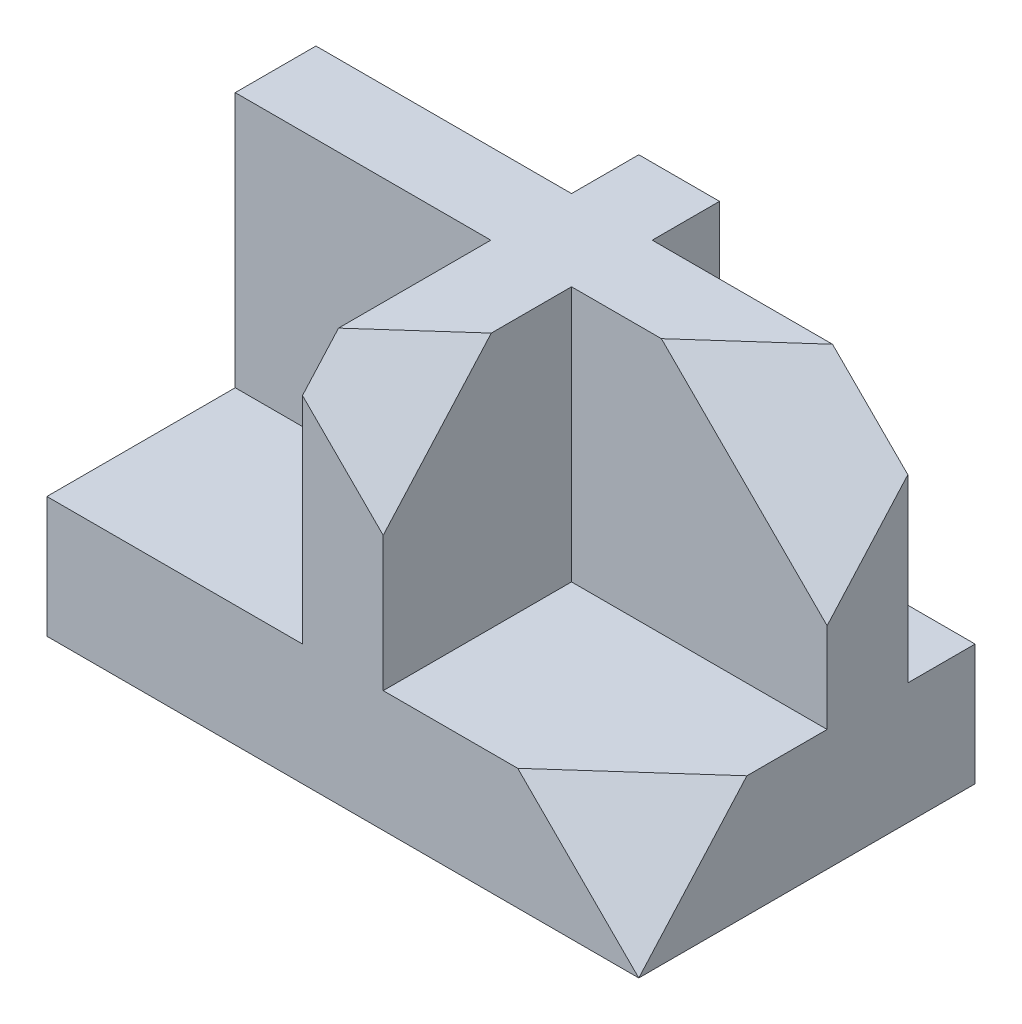
ISO-10303-21;
HEADER;
FILE_DESCRIPTION(('STEP AP214'),'2;1');
FILE_NAME('part.step','',(''),(''),'','','');
FILE_SCHEMA(('AUTOMOTIVE_DESIGN { 1 0 10303 214 1 1 1 1 }'));
ENDSEC;
DATA;
#1=APPLICATION_CONTEXT('core data for automotive mechanical design processes');
#2=APPLICATION_PROTOCOL_DEFINITION('international standard','automotive_design',2000,#1);
#3=PRODUCT_CONTEXT('',#1,'mechanical');
#4=PRODUCT('Part','Part','',(#3));
#5=PRODUCT_RELATED_PRODUCT_CATEGORY('part','',(#4));
#6=PRODUCT_DEFINITION_FORMATION('','',#4);
#7=PRODUCT_DEFINITION_CONTEXT('part definition',#1,'design');
#8=PRODUCT_DEFINITION('design','',#6,#7);
#9=PRODUCT_DEFINITION_SHAPE('','',#8);
#10=(LENGTH_UNIT() NAMED_UNIT(*) SI_UNIT(.MILLI.,.METRE.));
#11=(NAMED_UNIT(*) PLANE_ANGLE_UNIT() SI_UNIT($,.RADIAN.));
#12=(NAMED_UNIT(*) SI_UNIT($,.STERADIAN.) SOLID_ANGLE_UNIT());
#13=UNCERTAINTY_MEASURE_WITH_UNIT(LENGTH_MEASURE(1.E-05),#10,'distance_accuracy_value','');
#14=(GEOMETRIC_REPRESENTATION_CONTEXT(3) GLOBAL_UNCERTAINTY_ASSIGNED_CONTEXT((#13)) GLOBAL_UNIT_ASSIGNED_CONTEXT((#10,
#11,#12)) REPRESENTATION_CONTEXT('',''));
#15=CARTESIAN_POINT('',(0.,0.,0.));
#16=DIRECTION('',(0.,0.,1.));
#17=DIRECTION('',(1.,0.,0.));
#18=AXIS2_PLACEMENT_3D('',#15,#16,#17);
#19=CARTESIAN_POINT('',(0.,18.,0.));
#20=DIRECTION('',(0.,-1.,0.));
#21=DIRECTION('',(0.,0.,-1.));
#22=AXIS2_PLACEMENT_3D('',#19,#20,#21);
#23=PLANE('',#22);
#24=DIRECTION('',(-0.745937661625918,0.,0.666015769308848));
#25=VECTOR('',#24,1.);
#26=CARTESIAN_POINT('',(31.0503903477639,18.,34.776437189496));
#27=LINE('',#26,#25);
#28=CARTESIAN_POINT('',(88.,18.,-16.0714285714286));
#29=VERTEX_POINT('',#28);
#30=CARTESIAN_POINT('',(69.9999999999998,18.,0.));
#31=VERTEX_POINT('',#30);
#32=EDGE_CURVE('E200',#29,#31,#27,.T.);
#33=ORIENTED_EDGE('',*,*,#32,.F.);
#34=DIRECTION('',(0.,0.,-1.));
#35=VECTOR('',#34,1.);
#36=CARTESIAN_POINT('',(88.,18.,0.));
#37=LINE('',#36,#35);
#38=CARTESIAN_POINT('',(88.,18.,-28.));
#39=VERTEX_POINT('',#38);
#40=EDGE_CURVE('E259',#29,#39,#37,.T.);
#41=ORIENTED_EDGE('',*,*,#40,.T.);
#42=DIRECTION('',(1.,0.,0.));
#43=VECTOR('',#42,1.);
#44=CARTESIAN_POINT('',(50.,18.,-28.));
#45=LINE('',#44,#43);
#46=CARTESIAN_POINT('',(50.,18.,-28.));
#47=VERTEX_POINT('',#46);
#48=EDGE_CURVE('E212',#47,#39,#45,.T.);
#49=ORIENTED_EDGE('',*,*,#48,.F.);
#50=DIRECTION('',(0.,0.,-1.));
#51=VECTOR('',#50,1.);
#52=CARTESIAN_POINT('',(50.,18.,-28.));
#53=LINE('',#52,#51);
#54=CARTESIAN_POINT('',(50.,18.,0.));
#55=VERTEX_POINT('',#54);
#56=EDGE_CURVE('E209',#55,#47,#53,.T.);
#57=ORIENTED_EDGE('',*,*,#56,.F.);
#58=DIRECTION('',(1.,0.,0.));
#59=VECTOR('',#58,1.);
#60=CARTESIAN_POINT('',(0.,18.,0.));
#61=LINE('',#60,#59);
#62=EDGE_CURVE('E253',#55,#31,#61,.T.);
#63=ORIENTED_EDGE('',*,*,#62,.T.);
#64=EDGE_LOOP('',(#33,#41,#49,#57,#63));
#65=FACE_BOUND('',#64,.T.);
#66=ADVANCED_FACE('F36',(#65),#23,.F.);
#67=CARTESIAN_POINT('',(0.,18.,0.));
#68=DIRECTION('',(0.,0.,-1.));
#69=DIRECTION('',(-1.,0.,0.));
#70=AXIS2_PLACEMENT_3D('',#67,#68,#69);
#71=PLANE('',#70);
#72=DIRECTION('',(0.707106781186551,-0.707106781186544,0.));
#73=VECTOR('',#72,1.);
#74=CARTESIAN_POINT('',(34.9999999999995,52.9999999999999,0.));
#75=LINE('',#74,#73);
#76=CARTESIAN_POINT('',(38.,49.9999999999995,0.));
#77=VERTEX_POINT('',#76);
#78=CARTESIAN_POINT('',(50.,37.9999999999996,0.));
#79=VERTEX_POINT('',#78);
#80=EDGE_CURVE('E320',#77,#79,#75,.T.);
#81=ORIENTED_EDGE('',*,*,#80,.F.);
#82=DIRECTION('',(0.,-1.,0.));
#83=VECTOR('',#82,1.);
#84=CARTESIAN_POINT('',(38.,56.,0.));
#85=LINE('',#84,#83);
#86=CARTESIAN_POINT('',(38.,18.,0.));
#87=VERTEX_POINT('',#86);
#88=EDGE_CURVE('E236',#77,#87,#85,.T.);
#89=ORIENTED_EDGE('',*,*,#88,.T.);
#90=CARTESIAN_POINT('',(0.,18.,0.));
#91=VERTEX_POINT('',#90);
#92=EDGE_CURVE('E255',#91,#87,#61,.T.);
#93=ORIENTED_EDGE('',*,*,#92,.F.);
#94=DIRECTION('',(0.,-1.,0.));
#95=VECTOR('',#94,1.);
#96=CARTESIAN_POINT('',(0.,18.,0.));
#97=LINE('',#96,#95);
#98=CARTESIAN_POINT('',(0.,0.,0.));
#99=VERTEX_POINT('',#98);
#100=EDGE_CURVE('E167',#91,#99,#97,.T.);
#101=ORIENTED_EDGE('',*,*,#100,.T.);
#102=DIRECTION('',(1.,0.,0.));
#103=VECTOR('',#102,1.);
#104=CARTESIAN_POINT('',(0.,0.,0.));
#105=LINE('',#104,#103);
#106=CARTESIAN_POINT('',(88.,0.,0.));
#107=VERTEX_POINT('',#106);
#108=EDGE_CURVE('E267',#99,#107,#105,.T.);
#109=ORIENTED_EDGE('',*,*,#108,.T.);
#110=EDGE_CURVE('E319',#31,#107,#75,.T.);
#111=ORIENTED_EDGE('',*,*,#110,.F.);
#112=ORIENTED_EDGE('',*,*,#62,.F.);
#113=DIRECTION('',(0.,-1.,0.));
#114=VECTOR('',#113,1.);
#115=CARTESIAN_POINT('',(50.,56.,0.));
#116=LINE('',#115,#114);
#117=EDGE_CURVE('E234',#79,#55,#116,.T.);
#118=ORIENTED_EDGE('',*,*,#117,.F.);
#119=EDGE_LOOP('',(#81,#89,#93,#101,#109,#111,#112,#118));
#120=FACE_BOUND('',#119,.T.);
#121=ADVANCED_FACE('F283',(#120),#71,.F.);
#122=CARTESIAN_POINT('',(88.,18.,0.));
#123=DIRECTION('',(-1.,0.,0.));
#124=DIRECTION('',(0.,0.,1.));
#125=AXIS2_PLACEMENT_3D('',#122,#123,#124);
#126=PLANE('',#125);
#127=DIRECTION('',(0.,0.745937661625915,-0.666015769308852));
#128=VECTOR('',#127,1.);
#129=CARTESIAN_POINT('',(88.,10.0156139105749,-8.94251242015614));
#130=LINE('',#129,#128);
#131=EDGE_CURVE('E301',#107,#29,#130,.T.);
#132=ORIENTED_EDGE('',*,*,#131,.F.);
#133=DIRECTION('',(0.,0.,-1.));
#134=VECTOR('',#133,1.);
#135=CARTESIAN_POINT('',(88.,0.,0.));
#136=LINE('',#135,#134);
#137=CARTESIAN_POINT('',(88.,0.,-50.));
#138=VERTEX_POINT('',#137);
#139=EDGE_CURVE('E270',#107,#138,#136,.T.);
#140=ORIENTED_EDGE('',*,*,#139,.T.);
#141=DIRECTION('',(0.,-1.,0.));
#142=VECTOR('',#141,1.);
#143=CARTESIAN_POINT('',(88.,18.,-50.));
#144=LINE('',#143,#142);
#145=CARTESIAN_POINT('',(88.,18.,-50.));
#146=VERTEX_POINT('',#145);
#147=EDGE_CURVE('E276',#146,#138,#144,.T.);
#148=ORIENTED_EDGE('',*,*,#147,.F.);
#149=CARTESIAN_POINT('',(88.,18.,-40.));
#150=VERTEX_POINT('',#149);
#151=EDGE_CURVE('E258',#150,#146,#37,.T.);
#152=ORIENTED_EDGE('',*,*,#151,.F.);
#153=DIRECTION('',(0.,-1.,0.));
#154=VECTOR('',#153,1.);
#155=CARTESIAN_POINT('',(88.,56.,-40.));
#156=LINE('',#155,#154);
#157=CARTESIAN_POINT('',(88.,44.8,-40.));
#158=VERTEX_POINT('',#157);
#159=EDGE_CURVE('E229',#158,#150,#156,.T.);
#160=ORIENTED_EDGE('',*,*,#159,.F.);
#161=CARTESIAN_POINT('',(88.,31.36,-28.));
#162=VERTEX_POINT('',#161);
#163=EDGE_CURVE('E177',#162,#158,#130,.T.);
#164=ORIENTED_EDGE('',*,*,#163,.F.);
#165=DIRECTION('',(0.,-1.,0.));
#166=VECTOR('',#165,1.);
#167=CARTESIAN_POINT('',(88.,56.,-28.));
#168=LINE('',#167,#166);
#169=EDGE_CURVE('E176',#162,#39,#168,.T.);
#170=ORIENTED_EDGE('',*,*,#169,.T.);
#171=ORIENTED_EDGE('',*,*,#40,.F.);
#172=EDGE_LOOP('',(#132,#140,#148,#152,#160,#164,#170,#171));
#173=FACE_BOUND('',#172,.T.);
#174=ADVANCED_FACE('F297',(#173),#126,.F.);
#175=CARTESIAN_POINT('',(38.,56.,-28.));
#176=DIRECTION('',(1.,0.,0.));
#177=DIRECTION('',(0.,0.,-1.));
#178=AXIS2_PLACEMENT_3D('',#175,#176,#177);
#179=PLANE('',#178);
#180=DIRECTION('',(0.,-0.745937661625915,0.666015769308852));
#181=VECTOR('',#180,1.);
#182=CARTESIAN_POINT('',(38.,67.2491128459898,-15.4009936124914));
#183=LINE('',#182,#181);
#184=CARTESIAN_POINT('',(38.,56.,-5.35714285714331));
#185=VERTEX_POINT('',#184);
#186=EDGE_CURVE('E317',#185,#77,#183,.T.);
#187=ORIENTED_EDGE('',*,*,#186,.F.);
#188=DIRECTION('',(0.,0.,1.));
#189=VECTOR('',#188,1.);
#190=CARTESIAN_POINT('',(38.,56.,-28.));
#191=LINE('',#190,#189);
#192=CARTESIAN_POINT('',(38.,56.,-28.));
#193=VERTEX_POINT('',#192);
#194=EDGE_CURVE('E188',#193,#185,#191,.T.);
#195=ORIENTED_EDGE('',*,*,#194,.F.);
#196=DIRECTION('',(0.,-1.,0.));
#197=VECTOR('',#196,1.);
#198=CARTESIAN_POINT('',(38.,56.,-28.));
#199=LINE('',#198,#197);
#200=CARTESIAN_POINT('',(38.,18.,-28.));
#201=VERTEX_POINT('',#200);
#202=EDGE_CURVE('E238',#193,#201,#199,.T.);
#203=ORIENTED_EDGE('',*,*,#202,.T.);
#204=DIRECTION('',(0.,0.,1.));
#205=VECTOR('',#204,1.);
#206=CARTESIAN_POINT('',(38.,18.,-28.));
#207=LINE('',#206,#205);
#208=EDGE_CURVE('E206',#201,#87,#207,.T.);
#209=ORIENTED_EDGE('',*,*,#208,.T.);
#210=ORIENTED_EDGE('',*,*,#88,.F.);
#211=EDGE_LOOP('',(#187,#195,#203,#209,#210));
#212=FACE_BOUND('',#211,.T.);
#213=ADVANCED_FACE('F339',(#212),#179,.F.);
#214=CARTESIAN_POINT('',(50.,56.,-28.));
#215=DIRECTION('',(-1.,0.,0.));
#216=DIRECTION('',(0.,0.,1.));
#217=AXIS2_PLACEMENT_3D('',#214,#215,#216);
#218=PLANE('',#217);
#219=DIRECTION('',(0.,0.745937661625915,-0.666015769308852));
#220=VECTOR('',#219,1.);
#221=CARTESIAN_POINT('',(50.,61.9261887863731,-21.3626685592621));
#222=LINE('',#221,#220);
#223=CARTESIAN_POINT('',(50.,56.,-16.0714285714289));
#224=VERTEX_POINT('',#223);
#225=EDGE_CURVE('E59',#79,#224,#222,.T.);
#226=ORIENTED_EDGE('',*,*,#225,.F.);
#227=ORIENTED_EDGE('',*,*,#117,.T.);
#228=ORIENTED_EDGE('',*,*,#56,.T.);
#229=DIRECTION('',(0.,-1.,0.));
#230=VECTOR('',#229,1.);
#231=CARTESIAN_POINT('',(50.,56.,-28.));
#232=LINE('',#231,#230);
#233=CARTESIAN_POINT('',(50.,56.,-28.));
#234=VERTEX_POINT('',#233);
#235=EDGE_CURVE('E232',#234,#47,#232,.T.);
#236=ORIENTED_EDGE('',*,*,#235,.F.);
#237=DIRECTION('',(0.,0.,-1.));
#238=VECTOR('',#237,1.);
#239=CARTESIAN_POINT('',(50.,56.,-28.));
#240=LINE('',#239,#238);
#241=EDGE_CURVE('E182',#224,#234,#240,.T.);
#242=ORIENTED_EDGE('',*,*,#241,.F.);
#243=EDGE_LOOP('',(#226,#227,#228,#236,#242));
#244=FACE_BOUND('',#243,.T.);
#245=ADVANCED_FACE('F347',(#244),#218,.F.);
#246=CARTESIAN_POINT('',(50.,56.,-28.));
#247=DIRECTION('',(0.,0.,-1.));
#248=DIRECTION('',(-1.,0.,0.));
#249=AXIS2_PLACEMENT_3D('',#246,#247,#248);
#250=PLANE('',#249);
#251=DIRECTION('',(0.707106781186551,-0.707106781186544,0.));
#252=VECTOR('',#251,1.);
#253=CARTESIAN_POINT('',(56.6799999999998,62.6799999999999,-28.));
#254=LINE('',#253,#252);
#255=CARTESIAN_POINT('',(63.3599999999997,56.,-28.));
#256=VERTEX_POINT('',#255);
#257=EDGE_CURVE('E162',#256,#162,#254,.T.);
#258=ORIENTED_EDGE('',*,*,#257,.F.);
#259=DIRECTION('',(1.,0.,0.));
#260=VECTOR('',#259,1.);
#261=CARTESIAN_POINT('',(50.,56.,-28.));
#262=LINE('',#261,#260);
#263=EDGE_CURVE('E173',#234,#256,#262,.T.);
#264=ORIENTED_EDGE('',*,*,#263,.F.);
#265=ORIENTED_EDGE('',*,*,#235,.T.);
#266=ORIENTED_EDGE('',*,*,#48,.T.);
#267=ORIENTED_EDGE('',*,*,#169,.F.);
#268=EDGE_LOOP('',(#258,#264,#265,#266,#267));
#269=FACE_BOUND('',#268,.T.);
#270=ADVANCED_FACE('F171',(#269),#250,.F.);
#271=CARTESIAN_POINT('',(50.,56.,-40.));
#272=DIRECTION('',(0.,0.,1.));
#273=DIRECTION('',(1.,0.,0.));
#274=AXIS2_PLACEMENT_3D('',#271,#272,#273);
#275=PLANE('',#274);
#276=DIRECTION('',(-0.707106781186551,0.707106781186544,0.));
#277=VECTOR('',#276,1.);
#278=CARTESIAN_POINT('',(63.3999999999998,69.3999999999999,-40.));
#279=LINE('',#278,#277);
#280=CARTESIAN_POINT('',(76.7999999999999,56.,-40.));
#281=VERTEX_POINT('',#280);
#282=EDGE_CURVE('E51',#158,#281,#279,.T.);
#283=ORIENTED_EDGE('',*,*,#282,.F.);
#284=ORIENTED_EDGE('',*,*,#159,.T.);
#285=DIRECTION('',(-1.,0.,0.));
#286=VECTOR('',#285,1.);
#287=CARTESIAN_POINT('',(50.,18.,-40.));
#288=LINE('',#287,#286);
#289=CARTESIAN_POINT('',(50.,18.,-40.));
#290=VERTEX_POINT('',#289);
#291=EDGE_CURVE('E214',#150,#290,#288,.T.);
#292=ORIENTED_EDGE('',*,*,#291,.T.);
#293=DIRECTION('',(0.,-1.,0.));
#294=VECTOR('',#293,1.);
#295=CARTESIAN_POINT('',(50.,56.,-40.));
#296=LINE('',#295,#294);
#297=CARTESIAN_POINT('',(50.,56.,-40.));
#298=VERTEX_POINT('',#297);
#299=EDGE_CURVE('E226',#298,#290,#296,.T.);
#300=ORIENTED_EDGE('',*,*,#299,.F.);
#301=DIRECTION('',(-1.,0.,0.));
#302=VECTOR('',#301,1.);
#303=CARTESIAN_POINT('',(50.,56.,-40.));
#304=LINE('',#303,#302);
#305=EDGE_CURVE('E184',#281,#298,#304,.T.);
#306=ORIENTED_EDGE('',*,*,#305,.F.);
#307=EDGE_LOOP('',(#283,#284,#292,#300,#306));
#308=FACE_BOUND('',#307,.T.);
#309=ADVANCED_FACE('F314',(#308),#275,.F.);
#310=CARTESIAN_POINT('',(0.,56.,0.));
#311=DIRECTION('',(0.,1.,0.));
#312=DIRECTION('',(0.,0.,1.));
#313=AXIS2_PLACEMENT_3D('',#310,#311,#312);
#314=PLANE('',#313);
#315=ORIENTED_EDGE('',*,*,#194,.T.);
#316=DIRECTION('',(0.745937661625918,0.,-0.666015769308848));
#317=VECTOR('',#316,1.);
#318=CARTESIAN_POINT('',(14.1944641589776,56.,15.897799858055));
#319=LINE('',#318,#317);
#320=EDGE_CURVE('E11',#185,#224,#319,.T.);
#321=ORIENTED_EDGE('',*,*,#320,.T.);
#322=ORIENTED_EDGE('',*,*,#241,.T.);
#323=ORIENTED_EDGE('',*,*,#263,.T.);
#324=EDGE_CURVE('E40',#256,#281,#319,.T.);
#325=ORIENTED_EDGE('',*,*,#324,.T.);
#326=ORIENTED_EDGE('',*,*,#305,.T.);
#327=DIRECTION('',(0.,0.,-1.));
#328=VECTOR('',#327,1.);
#329=CARTESIAN_POINT('',(50.,56.,-50.));
#330=LINE('',#329,#328);
#331=CARTESIAN_POINT('',(50.,56.,-50.));
#332=VERTEX_POINT('',#331);
#333=EDGE_CURVE('E186',#298,#332,#330,.T.);
#334=ORIENTED_EDGE('',*,*,#333,.T.);
#335=DIRECTION('',(-1.,0.,0.));
#336=VECTOR('',#335,1.);
#337=CARTESIAN_POINT('',(38.,56.,-50.));
#338=LINE('',#337,#336);
#339=CARTESIAN_POINT('',(38.,56.,-50.));
#340=VERTEX_POINT('',#339);
#341=EDGE_CURVE('E193',#332,#340,#338,.T.);
#342=ORIENTED_EDGE('',*,*,#341,.T.);
#343=DIRECTION('',(0.,0.,1.));
#344=VECTOR('',#343,1.);
#345=CARTESIAN_POINT('',(38.,56.,-50.));
#346=LINE('',#345,#344);
#347=CARTESIAN_POINT('',(38.,56.,-40.));
#348=VERTEX_POINT('',#347);
#349=EDGE_CURVE('E220',#340,#348,#346,.T.);
#350=ORIENTED_EDGE('',*,*,#349,.T.);
#351=DIRECTION('',(-1.,0.,0.));
#352=VECTOR('',#351,1.);
#353=CARTESIAN_POINT('',(0.,56.,-40.));
#354=LINE('',#353,#352);
#355=CARTESIAN_POINT('',(0.,56.,-40.));
#356=VERTEX_POINT('',#355);
#357=EDGE_CURVE('E329',#348,#356,#354,.T.);
#358=ORIENTED_EDGE('',*,*,#357,.T.);
#359=DIRECTION('',(0.,0.,1.));
#360=VECTOR('',#359,1.);
#361=CARTESIAN_POINT('',(0.,56.,-40.));
#362=LINE('',#361,#360);
#363=CARTESIAN_POINT('',(0.,56.,-28.));
#364=VERTEX_POINT('',#363);
#365=EDGE_CURVE('E331',#356,#364,#362,.T.);
#366=ORIENTED_EDGE('',*,*,#365,.T.);
#367=DIRECTION('',(1.,0.,0.));
#368=VECTOR('',#367,1.);
#369=CARTESIAN_POINT('',(0.,56.,-28.));
#370=LINE('',#369,#368);
#371=EDGE_CURVE('E333',#364,#193,#370,.T.);
#372=ORIENTED_EDGE('',*,*,#371,.T.);
#373=EDGE_LOOP('',(#315,#321,#322,#323,#325,#326,#334,#342,#350,#358,#366,#372));
#374=FACE_BOUND('',#373,.T.);
#375=ADVANCED_FACE('F180',(#374),#314,.T.);
#376=DIRECTION('',(0.,0.,-1.));
#377=VECTOR('',#376,1.);
#378=CARTESIAN_POINT('',(50.,18.,-50.));
#379=LINE('',#378,#377);
#380=CARTESIAN_POINT('',(50.,18.,-50.));
#381=VERTEX_POINT('',#380);
#382=EDGE_CURVE('E217',#290,#381,#379,.T.);
#383=ORIENTED_EDGE('',*,*,#382,.F.);
#384=ORIENTED_EDGE('',*,*,#291,.F.);
#385=ORIENTED_EDGE('',*,*,#151,.T.);
#386=DIRECTION('',(-1.,0.,0.));
#387=VECTOR('',#386,1.);
#388=CARTESIAN_POINT('',(0.,18.,-50.));
#389=LINE('',#388,#387);
#390=EDGE_CURVE('E262',#146,#381,#389,.T.);
#391=ORIENTED_EDGE('',*,*,#390,.T.);
#392=EDGE_LOOP('',(#383,#384,#385,#391));
#393=FACE_BOUND('',#392,.T.);
#394=ADVANCED_FACE('F307',(#393),#23,.F.);
#395=ORIENTED_EDGE('',*,*,#208,.F.);
#396=DIRECTION('',(1.,0.,0.));
#397=VECTOR('',#396,1.);
#398=CARTESIAN_POINT('',(0.,18.,-28.));
#399=LINE('',#398,#397);
#400=CARTESIAN_POINT('',(0.,18.,-28.));
#401=VERTEX_POINT('',#400);
#402=EDGE_CURVE('E203',#401,#201,#399,.T.);
#403=ORIENTED_EDGE('',*,*,#402,.F.);
#404=DIRECTION('',(0.,0.,1.));
#405=VECTOR('',#404,1.);
#406=CARTESIAN_POINT('',(0.,18.,0.));
#407=LINE('',#406,#405);
#408=EDGE_CURVE('E254',#401,#91,#407,.T.);
#409=ORIENTED_EDGE('',*,*,#408,.T.);
#410=ORIENTED_EDGE('',*,*,#92,.T.);
#411=EDGE_LOOP('',(#395,#403,#409,#410));
#412=FACE_BOUND('',#411,.T.);
#413=ADVANCED_FACE('F359',(#412),#23,.F.);
#414=DIRECTION('',(0.,0.,1.));
#415=VECTOR('',#414,1.);
#416=CARTESIAN_POINT('',(38.,18.,-50.));
#417=LINE('',#416,#415);
#418=CARTESIAN_POINT('',(38.,18.,-50.));
#419=VERTEX_POINT('',#418);
#420=CARTESIAN_POINT('',(38.,18.,-40.));
#421=VERTEX_POINT('',#420);
#422=EDGE_CURVE('E196',#419,#421,#417,.T.);
#423=ORIENTED_EDGE('',*,*,#422,.F.);
#424=CARTESIAN_POINT('',(0.,18.,-50.));
#425=VERTEX_POINT('',#424);
#426=EDGE_CURVE('E261',#419,#425,#389,.T.);
#427=ORIENTED_EDGE('',*,*,#426,.T.);
#428=CARTESIAN_POINT('',(0.,18.,-40.));
#429=VERTEX_POINT('',#428);
#430=EDGE_CURVE('E251',#425,#429,#407,.T.);
#431=ORIENTED_EDGE('',*,*,#430,.T.);
#432=DIRECTION('',(-1.,0.,0.));
#433=VECTOR('',#432,1.);
#434=CARTESIAN_POINT('',(0.,18.,-40.));
#435=LINE('',#434,#433);
#436=EDGE_CURVE('E199',#421,#429,#435,.T.);
#437=ORIENTED_EDGE('',*,*,#436,.F.);
#438=EDGE_LOOP('',(#423,#427,#431,#437));
#439=FACE_BOUND('',#438,.T.);
#440=ADVANCED_FACE('F366',(#439),#23,.F.);
#441=CARTESIAN_POINT('',(0.,18.,0.));
#442=DIRECTION('',(1.,0.,0.));
#443=DIRECTION('',(0.,0.,-1.));
#444=AXIS2_PLACEMENT_3D('',#441,#442,#443);
#445=PLANE('',#444);
#446=DIRECTION('',(0.,0.,1.));
#447=VECTOR('',#446,1.);
#448=CARTESIAN_POINT('',(0.,0.,0.));
#449=LINE('',#448,#447);
#450=CARTESIAN_POINT('',(0.,0.,-50.));
#451=VERTEX_POINT('',#450);
#452=EDGE_CURVE('E250',#451,#99,#449,.T.);
#453=ORIENTED_EDGE('',*,*,#452,.T.);
#454=ORIENTED_EDGE('',*,*,#100,.F.);
#455=ORIENTED_EDGE('',*,*,#408,.F.);
#456=DIRECTION('',(0.,-1.,0.));
#457=VECTOR('',#456,1.);
#458=CARTESIAN_POINT('',(0.,56.,-28.));
#459=LINE('',#458,#457);
#460=EDGE_CURVE('E241',#364,#401,#459,.T.);
#461=ORIENTED_EDGE('',*,*,#460,.F.);
#462=ORIENTED_EDGE('',*,*,#365,.F.);
#463=DIRECTION('',(0.,-1.,0.));
#464=VECTOR('',#463,1.);
#465=CARTESIAN_POINT('',(0.,56.,-40.));
#466=LINE('',#465,#464);
#467=EDGE_CURVE('E244',#356,#429,#466,.T.);
#468=ORIENTED_EDGE('',*,*,#467,.T.);
#469=ORIENTED_EDGE('',*,*,#430,.F.);
#470=DIRECTION('',(0.,-1.,0.));
#471=VECTOR('',#470,1.);
#472=CARTESIAN_POINT('',(0.,18.,-50.));
#473=LINE('',#472,#471);
#474=EDGE_CURVE('E264',#425,#451,#473,.T.);
#475=ORIENTED_EDGE('',*,*,#474,.T.);
#476=EDGE_LOOP('',(#453,#454,#455,#461,#462,#468,#469,#475));
#477=FACE_BOUND('',#476,.T.);
#478=ADVANCED_FACE('F38',(#477),#445,.F.);
#479=CARTESIAN_POINT('',(0.,18.,-50.));
#480=DIRECTION('',(0.,0.,1.));
#481=DIRECTION('',(1.,0.,0.));
#482=AXIS2_PLACEMENT_3D('',#479,#480,#481);
#483=PLANE('',#482);
#484=DIRECTION('',(-1.,0.,0.));
#485=VECTOR('',#484,1.);
#486=CARTESIAN_POINT('',(0.,0.,-50.));
#487=LINE('',#486,#485);
#488=EDGE_CURVE('E272',#138,#451,#487,.T.);
#489=ORIENTED_EDGE('',*,*,#488,.T.);
#490=ORIENTED_EDGE('',*,*,#474,.F.);
#491=ORIENTED_EDGE('',*,*,#426,.F.);
#492=DIRECTION('',(0.,-1.,0.));
#493=VECTOR('',#492,1.);
#494=CARTESIAN_POINT('',(38.,56.,-50.));
#495=LINE('',#494,#493);
#496=EDGE_CURVE('E195',#340,#419,#495,.T.);
#497=ORIENTED_EDGE('',*,*,#496,.F.);
#498=ORIENTED_EDGE('',*,*,#341,.F.);
#499=DIRECTION('',(0.,-1.,0.));
#500=VECTOR('',#499,1.);
#501=CARTESIAN_POINT('',(50.,56.,-50.));
#502=LINE('',#501,#500);
#503=EDGE_CURVE('E223',#332,#381,#502,.T.);
#504=ORIENTED_EDGE('',*,*,#503,.T.);
#505=ORIENTED_EDGE('',*,*,#390,.F.);
#506=ORIENTED_EDGE('',*,*,#147,.T.);
#507=EDGE_LOOP('',(#489,#490,#491,#497,#498,#504,#505,#506));
#508=FACE_BOUND('',#507,.T.);
#509=ADVANCED_FACE('F303',(#508),#483,.F.);
#510=CARTESIAN_POINT('',(0.,0.,0.));
#511=DIRECTION('',(0.,-1.,0.));
#512=DIRECTION('',(0.,0.,-1.));
#513=AXIS2_PLACEMENT_3D('',#510,#511,#512);
#514=PLANE('',#513);
#515=ORIENTED_EDGE('',*,*,#452,.F.);
#516=ORIENTED_EDGE('',*,*,#488,.F.);
#517=ORIENTED_EDGE('',*,*,#139,.F.);
#518=ORIENTED_EDGE('',*,*,#108,.F.);
#519=EDGE_LOOP('',(#515,#516,#517,#518));
#520=FACE_BOUND('',#519,.T.);
#521=ADVANCED_FACE('F293',(#520),#514,.T.);
#522=CARTESIAN_POINT('',(38.,56.,-50.));
#523=DIRECTION('',(1.,0.,0.));
#524=DIRECTION('',(0.,0.,-1.));
#525=AXIS2_PLACEMENT_3D('',#522,#523,#524);
#526=PLANE('',#525);
#527=ORIENTED_EDGE('',*,*,#422,.T.);
#528=DIRECTION('',(0.,-1.,0.));
#529=VECTOR('',#528,1.);
#530=CARTESIAN_POINT('',(38.,56.,-40.));
#531=LINE('',#530,#529);
#532=EDGE_CURVE('E247',#348,#421,#531,.T.);
#533=ORIENTED_EDGE('',*,*,#532,.F.);
#534=ORIENTED_EDGE('',*,*,#349,.F.);
#535=ORIENTED_EDGE('',*,*,#496,.T.);
#536=EDGE_LOOP('',(#527,#533,#534,#535));
#537=FACE_BOUND('',#536,.T.);
#538=ADVANCED_FACE('F382',(#537),#526,.F.);
#539=CARTESIAN_POINT('',(0.,56.,-40.));
#540=DIRECTION('',(0.,0.,1.));
#541=DIRECTION('',(1.,0.,0.));
#542=AXIS2_PLACEMENT_3D('',#539,#540,#541);
#543=PLANE('',#542);
#544=ORIENTED_EDGE('',*,*,#436,.T.);
#545=ORIENTED_EDGE('',*,*,#467,.F.);
#546=ORIENTED_EDGE('',*,*,#357,.F.);
#547=ORIENTED_EDGE('',*,*,#532,.T.);
#548=EDGE_LOOP('',(#544,#545,#546,#547));
#549=FACE_BOUND('',#548,.T.);
#550=ADVANCED_FACE('F387',(#549),#543,.F.);
#551=CARTESIAN_POINT('',(0.,56.,-28.));
#552=DIRECTION('',(0.,0.,-1.));
#553=DIRECTION('',(-1.,0.,0.));
#554=AXIS2_PLACEMENT_3D('',#551,#552,#553);
#555=PLANE('',#554);
#556=ORIENTED_EDGE('',*,*,#402,.T.);
#557=ORIENTED_EDGE('',*,*,#202,.F.);
#558=ORIENTED_EDGE('',*,*,#371,.F.);
#559=ORIENTED_EDGE('',*,*,#460,.T.);
#560=EDGE_LOOP('',(#556,#557,#558,#559));
#561=FACE_BOUND('',#560,.T.);
#562=ADVANCED_FACE('F389',(#561),#555,.F.);
#563=CARTESIAN_POINT('',(50.,56.,-50.));
#564=DIRECTION('',(-1.,0.,0.));
#565=DIRECTION('',(0.,0.,1.));
#566=AXIS2_PLACEMENT_3D('',#563,#564,#565);
#567=PLANE('',#566);
#568=ORIENTED_EDGE('',*,*,#382,.T.);
#569=ORIENTED_EDGE('',*,*,#503,.F.);
#570=ORIENTED_EDGE('',*,*,#333,.F.);
#571=ORIENTED_EDGE('',*,*,#299,.T.);
#572=EDGE_LOOP('',(#568,#569,#570,#571));
#573=FACE_BOUND('',#572,.T.);
#574=ADVANCED_FACE('F310',(#573),#567,.F.);
#575=CARTESIAN_POINT('',(27.0403146509337,27.040314650934,30.2851524090461));
#576=DIRECTION('',(0.554325087698112,0.554325087698118,0.620844098221892));
#577=DIRECTION('',(0.,-0.745937661625915,0.666015769308852));
#578=AXIS2_PLACEMENT_3D('',#575,#576,#577);
#579=PLANE('',#578);
#580=ORIENTED_EDGE('',*,*,#163,.T.);
#581=ORIENTED_EDGE('',*,*,#282,.T.);
#582=ORIENTED_EDGE('',*,*,#324,.F.);
#583=ORIENTED_EDGE('',*,*,#257,.T.);
#584=EDGE_LOOP('',(#580,#581,#582,#583));
#585=FACE_BOUND('',#584,.T.);
#586=ADVANCED_FACE('F161',(#585),#579,.T.);
#587=ORIENTED_EDGE('',*,*,#80,.T.);
#588=ORIENTED_EDGE('',*,*,#225,.T.);
#589=ORIENTED_EDGE('',*,*,#320,.F.);
#590=ORIENTED_EDGE('',*,*,#186,.T.);
#591=EDGE_LOOP('',(#587,#588,#589,#590));
#592=FACE_BOUND('',#591,.T.);
#593=ADVANCED_FACE('F341',(#592),#579,.T.);
#594=ORIENTED_EDGE('',*,*,#32,.T.);
#595=ORIENTED_EDGE('',*,*,#110,.T.);
#596=ORIENTED_EDGE('',*,*,#131,.T.);
#597=EDGE_LOOP('',(#594,#595,#596));
#598=FACE_BOUND('',#597,.T.);
#599=ADVANCED_FACE('F349',(#598),#579,.T.);
#600=CLOSED_SHELL('',(#66,#121,#174,#213,#245,#270,#309,#375,#394,#413,#440,#478,#509,#521,#538,
#550,#562,#574,#586,#593,#599));
#601=MANIFOLD_SOLID_BREP('B2',#600);
#602=ADVANCED_BREP_SHAPE_REPRESENTATION('',(#18,#601),#14);
#603=SHAPE_DEFINITION_REPRESENTATION(#9,#602);
ENDSEC;
END-ISO-10303-21;
